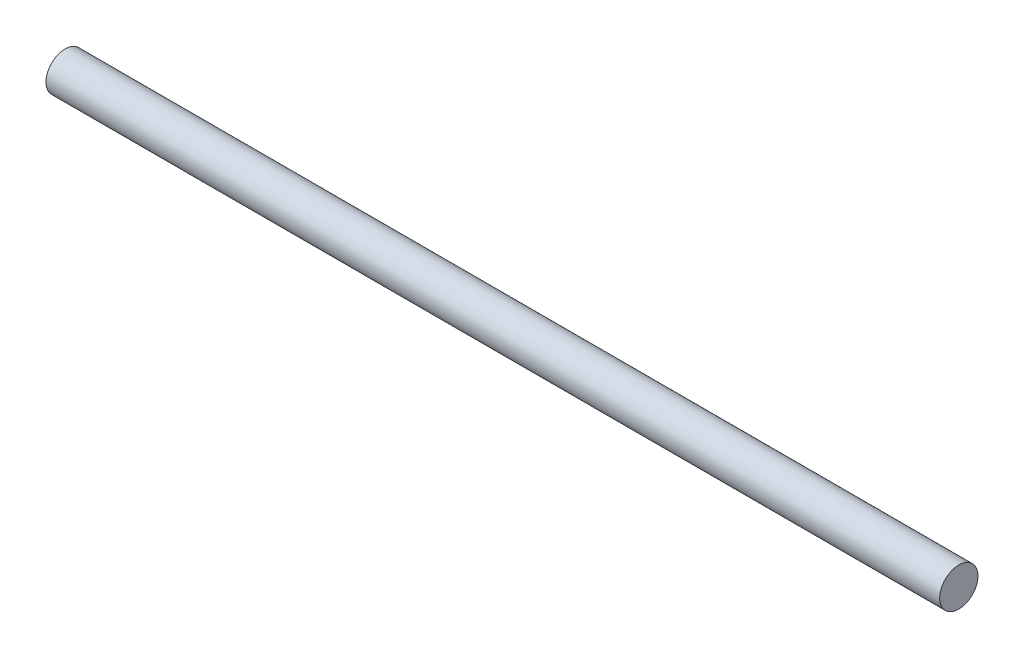
ISO-10303-21;
HEADER;
FILE_DESCRIPTION(('STEP AP214'),'2;1');
FILE_NAME('part.step','',(''),(''),'','','');
FILE_SCHEMA(('AUTOMOTIVE_DESIGN { 1 0 10303 214 1 1 1 1 }'));
ENDSEC;
DATA;
#1=APPLICATION_CONTEXT('core data for automotive mechanical design processes');
#2=APPLICATION_PROTOCOL_DEFINITION('international standard','automotive_design',2000,#1);
#3=PRODUCT_CONTEXT('',#1,'mechanical');
#4=PRODUCT('Part','Part','',(#3));
#5=PRODUCT_RELATED_PRODUCT_CATEGORY('part','',(#4));
#6=PRODUCT_DEFINITION_FORMATION('','',#4);
#7=PRODUCT_DEFINITION_CONTEXT('part definition',#1,'design');
#8=PRODUCT_DEFINITION('design','',#6,#7);
#9=PRODUCT_DEFINITION_SHAPE('','',#8);
#10=(LENGTH_UNIT() NAMED_UNIT(*) SI_UNIT(.MILLI.,.METRE.));
#11=(NAMED_UNIT(*) PLANE_ANGLE_UNIT() SI_UNIT($,.RADIAN.));
#12=(NAMED_UNIT(*) SI_UNIT($,.STERADIAN.) SOLID_ANGLE_UNIT());
#13=UNCERTAINTY_MEASURE_WITH_UNIT(LENGTH_MEASURE(1.E-05),#10,'distance_accuracy_value','');
#14=(GEOMETRIC_REPRESENTATION_CONTEXT(3) GLOBAL_UNCERTAINTY_ASSIGNED_CONTEXT((#13)) GLOBAL_UNIT_ASSIGNED_CONTEXT((#10,
#11,#12)) REPRESENTATION_CONTEXT('',''));
#15=CARTESIAN_POINT('',(0.,0.,0.));
#16=DIRECTION('',(0.,0.,1.));
#17=DIRECTION('',(1.,0.,0.));
#18=AXIS2_PLACEMENT_3D('',#15,#16,#17);
#19=CARTESIAN_POINT('',(140.,0.,0.));
#20=DIRECTION('',(-1.,0.,0.));
#21=DIRECTION('',(0.,0.,1.));
#22=AXIS2_PLACEMENT_3D('',#19,#20,#21);
#23=CYLINDRICAL_SURFACE('',#22,3.);
#24=CARTESIAN_POINT('',(140.,0.,0.));
#25=DIRECTION('',(1.,0.,0.));
#26=DIRECTION('',(0.,0.,-1.));
#27=AXIS2_PLACEMENT_3D('',#24,#25,#26);
#28=CIRCLE('',#27,3.);
#29=CARTESIAN_POINT('',(140.,0.,-3.));
#30=VERTEX_POINT('',#29);
#31=EDGE_CURVE('E10',#30,#30,#28,.T.);
#32=ORIENTED_EDGE('',*,*,#31,.F.);
#33=EDGE_LOOP('',(#32));
#34=FACE_BOUND('',#33,.T.);
#35=CARTESIAN_POINT('',(0.,0.,0.));
#36=DIRECTION('',(1.,0.,0.));
#37=DIRECTION('',(0.,0.,-1.));
#38=AXIS2_PLACEMENT_3D('',#35,#36,#37);
#39=CIRCLE('',#38,3.);
#40=CARTESIAN_POINT('',(0.,0.,-3.));
#41=VERTEX_POINT('',#40);
#42=EDGE_CURVE('E34',#41,#41,#39,.T.);
#43=ORIENTED_EDGE('',*,*,#42,.T.);
#44=EDGE_LOOP('',(#43));
#45=FACE_BOUND('',#44,.T.);
#46=ADVANCED_FACE('F31',(#34,#45),#23,.T.);
#47=CARTESIAN_POINT('',(140.,0.,0.));
#48=DIRECTION('',(1.,0.,0.));
#49=DIRECTION('',(0.,0.,-1.));
#50=AXIS2_PLACEMENT_3D('',#47,#48,#49);
#51=PLANE('',#50);
#52=ORIENTED_EDGE('',*,*,#31,.T.);
#53=EDGE_LOOP('',(#52));
#54=FACE_BOUND('',#53,.T.);
#55=ADVANCED_FACE('F46',(#54),#51,.T.);
#56=CARTESIAN_POINT('',(0.,0.,0.));
#57=DIRECTION('',(1.,0.,0.));
#58=DIRECTION('',(0.,0.,-1.));
#59=AXIS2_PLACEMENT_3D('',#56,#57,#58);
#60=PLANE('',#59);
#61=ORIENTED_EDGE('',*,*,#42,.F.);
#62=EDGE_LOOP('',(#61));
#63=FACE_BOUND('',#62,.T.);
#64=ADVANCED_FACE('F44',(#63),#60,.F.);
#65=CLOSED_SHELL('',(#46,#55,#64));
#66=MANIFOLD_SOLID_BREP('B2',#65);
#67=ADVANCED_BREP_SHAPE_REPRESENTATION('',(#18,#66),#14);
#68=SHAPE_DEFINITION_REPRESENTATION(#9,#67);
ENDSEC;
END-ISO-10303-21;
